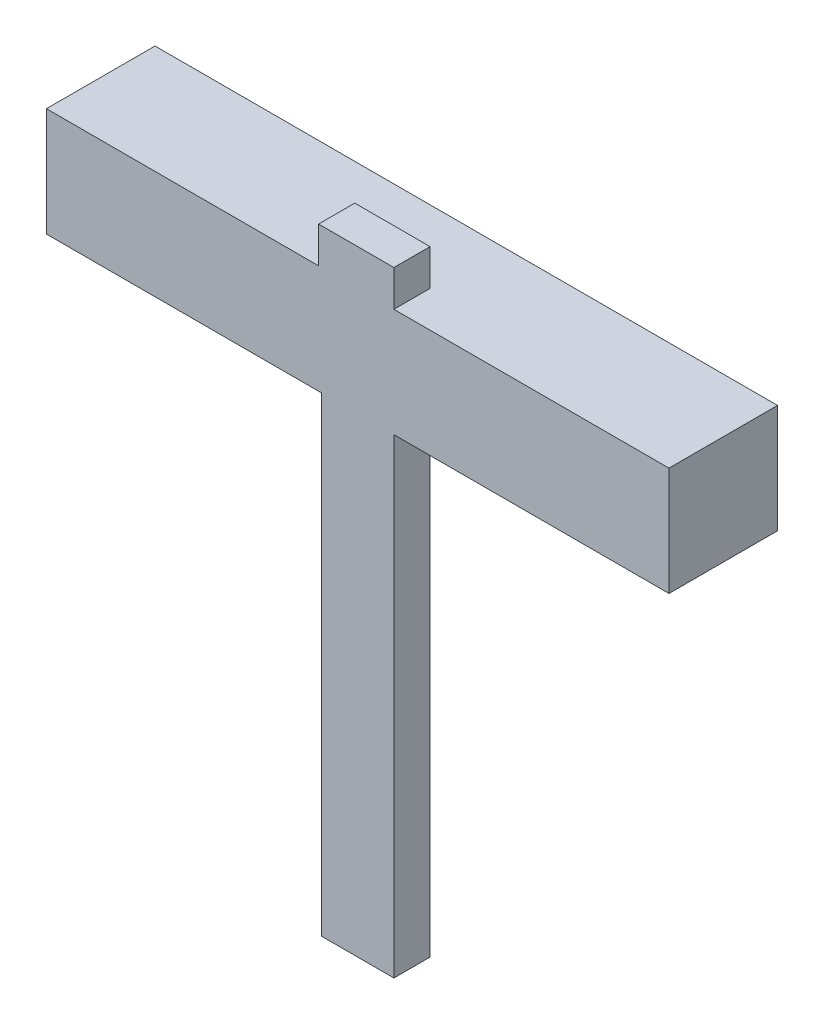
ISO-10303-21;
HEADER;
FILE_DESCRIPTION(('STEP AP214'),'2;1');
FILE_NAME('part.step','',(''),(''),'','','');
FILE_SCHEMA(('AUTOMOTIVE_DESIGN { 1 0 10303 214 1 1 1 1 }'));
ENDSEC;
DATA;
#1=APPLICATION_CONTEXT('core data for automotive mechanical design processes');
#2=APPLICATION_PROTOCOL_DEFINITION('international standard','automotive_design',2000,#1);
#3=PRODUCT_CONTEXT('',#1,'mechanical');
#4=PRODUCT('Part','Part','',(#3));
#5=PRODUCT_RELATED_PRODUCT_CATEGORY('part','',(#4));
#6=PRODUCT_DEFINITION_FORMATION('','',#4);
#7=PRODUCT_DEFINITION_CONTEXT('part definition',#1,'design');
#8=PRODUCT_DEFINITION('design','',#6,#7);
#9=PRODUCT_DEFINITION_SHAPE('','',#8);
#10=(LENGTH_UNIT() NAMED_UNIT(*) SI_UNIT(.MILLI.,.METRE.));
#11=(NAMED_UNIT(*) PLANE_ANGLE_UNIT() SI_UNIT($,.RADIAN.));
#12=(NAMED_UNIT(*) SI_UNIT($,.STERADIAN.) SOLID_ANGLE_UNIT());
#13=UNCERTAINTY_MEASURE_WITH_UNIT(LENGTH_MEASURE(1.E-05),#10,'distance_accuracy_value','');
#14=(GEOMETRIC_REPRESENTATION_CONTEXT(3) GLOBAL_UNCERTAINTY_ASSIGNED_CONTEXT((#13)) GLOBAL_UNIT_ASSIGNED_CONTEXT((#10,
#11,#12)) REPRESENTATION_CONTEXT('',''));
#15=CARTESIAN_POINT('',(0.,0.,0.));
#16=DIRECTION('',(0.,0.,1.));
#17=DIRECTION('',(1.,0.,0.));
#18=AXIS2_PLACEMENT_3D('',#15,#16,#17);
#19=CARTESIAN_POINT('',(0.,15.,0.));
#20=DIRECTION('',(0.,-1.,0.));
#21=DIRECTION('',(0.,0.,-1.));
#22=AXIS2_PLACEMENT_3D('',#19,#20,#21);
#23=PLANE('',#22);
#24=DIRECTION('',(0.,0.,-1.));
#25=VECTOR('',#24,1.);
#26=CARTESIAN_POINT('',(5.,15.,0.));
#27=LINE('',#26,#25);
#28=CARTESIAN_POINT('',(5.,15.,5.));
#29=VERTEX_POINT('',#28);
#30=CARTESIAN_POINT('',(5.,15.,0.));
#31=VERTEX_POINT('',#30);
#32=EDGE_CURVE('E59',#29,#31,#27,.T.);
#33=ORIENTED_EDGE('',*,*,#32,.F.);
#34=DIRECTION('',(1.,0.,0.));
#35=VECTOR('',#34,1.);
#36=CARTESIAN_POINT('',(-40.,15.,5.));
#37=LINE('',#36,#35);
#38=CARTESIAN_POINT('',(43.,15.,5.));
#39=VERTEX_POINT('',#38);
#40=EDGE_CURVE('E232',#29,#39,#37,.T.);
#41=ORIENTED_EDGE('',*,*,#40,.T.);
#42=DIRECTION('',(0.,0.,1.));
#43=VECTOR('',#42,1.);
#44=CARTESIAN_POINT('',(43.,15.,5.));
#45=LINE('',#44,#43);
#46=CARTESIAN_POINT('',(43.,15.,-10.));
#47=VERTEX_POINT('',#46);
#48=EDGE_CURVE('E222',#47,#39,#45,.T.);
#49=ORIENTED_EDGE('',*,*,#48,.F.);
#50=DIRECTION('',(-1.,0.,0.));
#51=VECTOR('',#50,1.);
#52=CARTESIAN_POINT('',(-40.,15.,-10.));
#53=LINE('',#52,#51);
#54=CARTESIAN_POINT('',(-43.,15.,-10.));
#55=VERTEX_POINT('',#54);
#56=EDGE_CURVE('E231',#47,#55,#53,.T.);
#57=ORIENTED_EDGE('',*,*,#56,.T.);
#58=DIRECTION('',(0.,0.,-1.));
#59=VECTOR('',#58,1.);
#60=CARTESIAN_POINT('',(-43.,15.,-10.));
#61=LINE('',#60,#59);
#62=CARTESIAN_POINT('',(-43.,15.,5.));
#63=VERTEX_POINT('',#62);
#64=EDGE_CURVE('E208',#63,#55,#61,.T.);
#65=ORIENTED_EDGE('',*,*,#64,.F.);
#66=CARTESIAN_POINT('',(-5.40455395030204,15.,5.));
#67=VERTEX_POINT('',#66);
#68=EDGE_CURVE('E229',#63,#67,#37,.T.);
#69=ORIENTED_EDGE('',*,*,#68,.T.);
#70=DIRECTION('',(0.,0.,1.));
#71=VECTOR('',#70,1.);
#72=CARTESIAN_POINT('',(-5.40455395030204,15.,0.));
#73=LINE('',#72,#71);
#74=CARTESIAN_POINT('',(-5.40455395030204,15.,0.));
#75=VERTEX_POINT('',#74);
#76=EDGE_CURVE('E169',#75,#67,#73,.T.);
#77=ORIENTED_EDGE('',*,*,#76,.F.);
#78=DIRECTION('',(-1.,0.,0.));
#79=VECTOR('',#78,1.);
#80=CARTESIAN_POINT('',(-5.40455395030204,15.,0.));
#81=LINE('',#80,#79);
#82=EDGE_CURVE('E54',#31,#75,#81,.T.);
#83=ORIENTED_EDGE('',*,*,#82,.F.);
#84=EDGE_LOOP('',(#33,#41,#49,#57,#65,#69,#77,#83));
#85=FACE_BOUND('',#84,.T.);
#86=ADVANCED_FACE('F39',(#85),#23,.F.);
#87=CARTESIAN_POINT('',(5.,0.,5.));
#88=DIRECTION('',(0.,1.,0.));
#89=DIRECTION('',(0.,0.,1.));
#90=AXIS2_PLACEMENT_3D('',#87,#88,#89);
#91=PLANE('',#90);
#92=DIRECTION('',(0.,0.,-1.));
#93=VECTOR('',#92,1.);
#94=CARTESIAN_POINT('',(40.08,0.,0.));
#95=LINE('',#94,#93);
#96=CARTESIAN_POINT('',(40.08,0.,0.));
#97=VERTEX_POINT('',#96);
#98=CARTESIAN_POINT('',(40.08,0.,-10.));
#99=VERTEX_POINT('',#98);
#100=EDGE_CURVE('E172',#97,#99,#95,.T.);
#101=ORIENTED_EDGE('',*,*,#100,.T.);
#102=DIRECTION('',(-1.,0.,0.));
#103=VECTOR('',#102,1.);
#104=CARTESIAN_POINT('',(43.,0.,-10.));
#105=LINE('',#104,#103);
#106=CARTESIAN_POINT('',(43.,0.,-10.));
#107=VERTEX_POINT('',#106);
#108=EDGE_CURVE('E225',#107,#99,#105,.T.);
#109=ORIENTED_EDGE('',*,*,#108,.F.);
#110=DIRECTION('',(0.,0.,-1.));
#111=VECTOR('',#110,1.);
#112=CARTESIAN_POINT('',(43.,0.,5.));
#113=LINE('',#112,#111);
#114=CARTESIAN_POINT('',(43.,0.,5.));
#115=VERTEX_POINT('',#114);
#116=EDGE_CURVE('E217',#115,#107,#113,.T.);
#117=ORIENTED_EDGE('',*,*,#116,.F.);
#118=DIRECTION('',(1.,0.,0.));
#119=VECTOR('',#118,1.);
#120=CARTESIAN_POINT('',(5.,0.,5.));
#121=LINE('',#120,#119);
#122=CARTESIAN_POINT('',(5.,0.,5.));
#123=VERTEX_POINT('',#122);
#124=EDGE_CURVE('E236',#123,#115,#121,.T.);
#125=ORIENTED_EDGE('',*,*,#124,.F.);
#126=DIRECTION('',(0.,0.,-1.));
#127=VECTOR('',#126,1.);
#128=CARTESIAN_POINT('',(5.,0.,5.));
#129=LINE('',#128,#127);
#130=CARTESIAN_POINT('',(5.,0.,0.));
#131=VERTEX_POINT('',#130);
#132=EDGE_CURVE('E247',#123,#131,#129,.T.);
#133=ORIENTED_EDGE('',*,*,#132,.T.);
#134=DIRECTION('',(1.,0.,0.));
#135=VECTOR('',#134,1.);
#136=CARTESIAN_POINT('',(5.,0.,0.));
#137=LINE('',#136,#135);
#138=EDGE_CURVE('E234',#131,#97,#137,.T.);
#139=ORIENTED_EDGE('',*,*,#138,.T.);
#140=EDGE_LOOP('',(#101,#109,#117,#125,#133,#139));
#141=FACE_BOUND('',#140,.T.);
#142=ADVANCED_FACE('F41',(#141),#91,.F.);
#143=CARTESIAN_POINT('',(-40.,15.,-10.));
#144=DIRECTION('',(0.,0.,1.));
#145=DIRECTION('',(1.,0.,0.));
#146=AXIS2_PLACEMENT_3D('',#143,#144,#145);
#147=PLANE('',#146);
#148=DIRECTION('',(-1.,0.,0.));
#149=VECTOR('',#148,1.);
#150=CARTESIAN_POINT('',(-40.,10.,-10.));
#151=LINE('',#150,#149);
#152=CARTESIAN_POINT('',(40.08,10.,-10.));
#153=VERTEX_POINT('',#152);
#154=CARTESIAN_POINT('',(-40.08,10.,-10.));
#155=VERTEX_POINT('',#154);
#156=EDGE_CURVE('E228',#153,#155,#151,.T.);
#157=ORIENTED_EDGE('',*,*,#156,.T.);
#158=DIRECTION('',(0.,-1.,0.));
#159=VECTOR('',#158,1.);
#160=CARTESIAN_POINT('',(-40.08,10.,-10.));
#161=LINE('',#160,#159);
#162=CARTESIAN_POINT('',(-40.08,0.,-10.));
#163=VERTEX_POINT('',#162);
#164=EDGE_CURVE('E188',#155,#163,#161,.T.);
#165=ORIENTED_EDGE('',*,*,#164,.T.);
#166=DIRECTION('',(1.,0.,0.));
#167=VECTOR('',#166,1.);
#168=CARTESIAN_POINT('',(-43.,0.,-10.));
#169=LINE('',#168,#167);
#170=CARTESIAN_POINT('',(-43.,0.,-10.));
#171=VERTEX_POINT('',#170);
#172=EDGE_CURVE('E211',#171,#163,#169,.T.);
#173=ORIENTED_EDGE('',*,*,#172,.F.);
#174=DIRECTION('',(0.,-1.,0.));
#175=VECTOR('',#174,1.);
#176=CARTESIAN_POINT('',(-43.,15.,-10.));
#177=LINE('',#176,#175);
#178=EDGE_CURVE('E191',#55,#171,#177,.T.);
#179=ORIENTED_EDGE('',*,*,#178,.F.);
#180=ORIENTED_EDGE('',*,*,#56,.F.);
#181=DIRECTION('',(0.,1.,0.));
#182=VECTOR('',#181,1.);
#183=CARTESIAN_POINT('',(43.,15.,-10.));
#184=LINE('',#183,#182);
#185=EDGE_CURVE('E219',#107,#47,#184,.T.);
#186=ORIENTED_EDGE('',*,*,#185,.F.);
#187=ORIENTED_EDGE('',*,*,#108,.T.);
#188=DIRECTION('',(0.,-1.,0.));
#189=VECTOR('',#188,1.);
#190=CARTESIAN_POINT('',(40.08,10.,-10.));
#191=LINE('',#190,#189);
#192=EDGE_CURVE('E187',#153,#99,#191,.T.);
#193=ORIENTED_EDGE('',*,*,#192,.F.);
#194=EDGE_LOOP('',(#157,#165,#173,#179,#180,#186,#187,#193));
#195=FACE_BOUND('',#194,.T.);
#196=ADVANCED_FACE('F308',(#195),#147,.F.);
#197=CARTESIAN_POINT('',(-40.,0.,5.));
#198=DIRECTION('',(0.,1.,0.));
#199=DIRECTION('',(0.,0.,1.));
#200=AXIS2_PLACEMENT_3D('',#197,#198,#199);
#201=PLANE('',#200);
#202=DIRECTION('',(0.,0.,-1.));
#203=VECTOR('',#202,1.);
#204=CARTESIAN_POINT('',(-40.08,0.,0.));
#205=LINE('',#204,#203);
#206=CARTESIAN_POINT('',(-40.08,0.,0.));
#207=VERTEX_POINT('',#206);
#208=EDGE_CURVE('E185',#207,#163,#205,.T.);
#209=ORIENTED_EDGE('',*,*,#208,.F.);
#210=DIRECTION('',(1.,0.,0.));
#211=VECTOR('',#210,1.);
#212=CARTESIAN_POINT('',(-40.,0.,0.));
#213=LINE('',#212,#211);
#214=CARTESIAN_POINT('',(-5.,0.,0.));
#215=VERTEX_POINT('',#214);
#216=EDGE_CURVE('E251',#207,#215,#213,.T.);
#217=ORIENTED_EDGE('',*,*,#216,.T.);
#218=DIRECTION('',(0.,0.,-1.));
#219=VECTOR('',#218,1.);
#220=CARTESIAN_POINT('',(-5.,0.,5.));
#221=LINE('',#220,#219);
#222=CARTESIAN_POINT('',(-5.,0.,5.));
#223=VERTEX_POINT('',#222);
#224=EDGE_CURVE('E11',#223,#215,#221,.T.);
#225=ORIENTED_EDGE('',*,*,#224,.F.);
#226=DIRECTION('',(1.,0.,0.));
#227=VECTOR('',#226,1.);
#228=CARTESIAN_POINT('',(-40.,0.,5.));
#229=LINE('',#228,#227);
#230=CARTESIAN_POINT('',(-43.,0.,5.));
#231=VERTEX_POINT('',#230);
#232=EDGE_CURVE('E238',#231,#223,#229,.T.);
#233=ORIENTED_EDGE('',*,*,#232,.F.);
#234=DIRECTION('',(0.,0.,1.));
#235=VECTOR('',#234,1.);
#236=CARTESIAN_POINT('',(-43.,0.,-10.));
#237=LINE('',#236,#235);
#238=EDGE_CURVE('E202',#171,#231,#237,.T.);
#239=ORIENTED_EDGE('',*,*,#238,.F.);
#240=ORIENTED_EDGE('',*,*,#172,.T.);
#241=EDGE_LOOP('',(#209,#217,#225,#233,#239,#240));
#242=FACE_BOUND('',#241,.T.);
#243=ADVANCED_FACE('F292',(#242),#201,.F.);
#244=CARTESIAN_POINT('',(-5.,0.,5.));
#245=DIRECTION('',(1.,0.,0.));
#246=DIRECTION('',(0.,0.,-1.));
#247=AXIS2_PLACEMENT_3D('',#244,#245,#246);
#248=PLANE('',#247);
#249=DIRECTION('',(0.,-1.,0.));
#250=VECTOR('',#249,1.);
#251=CARTESIAN_POINT('',(-5.,0.,0.));
#252=LINE('',#251,#250);
#253=CARTESIAN_POINT('',(-5.,-65.,0.));
#254=VERTEX_POINT('',#253);
#255=EDGE_CURVE('E253',#215,#254,#252,.T.);
#256=ORIENTED_EDGE('',*,*,#255,.T.);
#257=DIRECTION('',(0.,0.,-1.));
#258=VECTOR('',#257,1.);
#259=CARTESIAN_POINT('',(-5.,-65.,5.));
#260=LINE('',#259,#258);
#261=CARTESIAN_POINT('',(-5.,-65.,5.));
#262=VERTEX_POINT('',#261);
#263=EDGE_CURVE('E47',#262,#254,#260,.T.);
#264=ORIENTED_EDGE('',*,*,#263,.F.);
#265=DIRECTION('',(0.,-1.,0.));
#266=VECTOR('',#265,1.);
#267=CARTESIAN_POINT('',(-5.,0.,5.));
#268=LINE('',#267,#266);
#269=EDGE_CURVE('E241',#223,#262,#268,.T.);
#270=ORIENTED_EDGE('',*,*,#269,.F.);
#271=ORIENTED_EDGE('',*,*,#224,.T.);
#272=EDGE_LOOP('',(#256,#264,#270,#271));
#273=FACE_BOUND('',#272,.T.);
#274=ADVANCED_FACE('F289',(#273),#248,.F.);
#275=CARTESIAN_POINT('',(-5.,-65.,5.));
#276=DIRECTION('',(0.,1.,0.));
#277=DIRECTION('',(-1.,0.,0.));
#278=AXIS2_PLACEMENT_3D('',#275,#276,#277);
#279=PLANE('',#278);
#280=DIRECTION('',(1.,0.,0.));
#281=VECTOR('',#280,1.);
#282=CARTESIAN_POINT('',(-5.,-65.,0.));
#283=LINE('',#282,#281);
#284=CARTESIAN_POINT('',(5.,-65.,0.));
#285=VERTEX_POINT('',#284);
#286=EDGE_CURVE('E255',#254,#285,#283,.T.);
#287=ORIENTED_EDGE('',*,*,#286,.T.);
#288=DIRECTION('',(0.,0.,-1.));
#289=VECTOR('',#288,1.);
#290=CARTESIAN_POINT('',(5.,-65.,5.));
#291=LINE('',#290,#289);
#292=CARTESIAN_POINT('',(5.,-65.,5.));
#293=VERTEX_POINT('',#292);
#294=EDGE_CURVE('E260',#293,#285,#291,.T.);
#295=ORIENTED_EDGE('',*,*,#294,.F.);
#296=DIRECTION('',(1.,0.,0.));
#297=VECTOR('',#296,1.);
#298=CARTESIAN_POINT('',(-5.,-65.,5.));
#299=LINE('',#298,#297);
#300=EDGE_CURVE('E243',#262,#293,#299,.T.);
#301=ORIENTED_EDGE('',*,*,#300,.F.);
#302=ORIENTED_EDGE('',*,*,#263,.T.);
#303=EDGE_LOOP('',(#287,#295,#301,#302));
#304=FACE_BOUND('',#303,.T.);
#305=ADVANCED_FACE('F267',(#304),#279,.F.);
#306=CARTESIAN_POINT('',(5.,0.,5.));
#307=DIRECTION('',(-1.,0.,0.));
#308=DIRECTION('',(0.,-1.,0.));
#309=AXIS2_PLACEMENT_3D('',#306,#307,#308);
#310=PLANE('',#309);
#311=DIRECTION('',(0.,1.,0.));
#312=VECTOR('',#311,1.);
#313=CARTESIAN_POINT('',(5.,0.,0.));
#314=LINE('',#313,#312);
#315=EDGE_CURVE('E239',#285,#131,#314,.T.);
#316=ORIENTED_EDGE('',*,*,#315,.T.);
#317=ORIENTED_EDGE('',*,*,#132,.F.);
#318=DIRECTION('',(0.,1.,0.));
#319=VECTOR('',#318,1.);
#320=CARTESIAN_POINT('',(5.,0.,5.));
#321=LINE('',#320,#319);
#322=EDGE_CURVE('E245',#293,#123,#321,.T.);
#323=ORIENTED_EDGE('',*,*,#322,.F.);
#324=ORIENTED_EDGE('',*,*,#294,.T.);
#325=EDGE_LOOP('',(#316,#317,#323,#324));
#326=FACE_BOUND('',#325,.T.);
#327=ADVANCED_FACE('F278',(#326),#310,.F.);
#328=CARTESIAN_POINT('',(0.,0.,5.));
#329=DIRECTION('',(0.,0.,-1.));
#330=DIRECTION('',(-1.,0.,0.));
#331=AXIS2_PLACEMENT_3D('',#328,#329,#330);
#332=PLANE('',#331);
#333=ORIENTED_EDGE('',*,*,#124,.T.);
#334=DIRECTION('',(0.,-1.,0.));
#335=VECTOR('',#334,1.);
#336=CARTESIAN_POINT('',(43.,15.,5.));
#337=LINE('',#336,#335);
#338=EDGE_CURVE('E214',#39,#115,#337,.T.);
#339=ORIENTED_EDGE('',*,*,#338,.F.);
#340=ORIENTED_EDGE('',*,*,#40,.F.);
#341=DIRECTION('',(0.,-1.,0.));
#342=VECTOR('',#341,1.);
#343=CARTESIAN_POINT('',(5.,20.,5.));
#344=LINE('',#343,#342);
#345=CARTESIAN_POINT('',(5.,20.,5.));
#346=VERTEX_POINT('',#345);
#347=EDGE_CURVE('E314',#346,#29,#344,.T.);
#348=ORIENTED_EDGE('',*,*,#347,.F.);
#349=DIRECTION('',(1.,0.,0.));
#350=VECTOR('',#349,1.);
#351=CARTESIAN_POINT('',(-5.40455395030204,20.,5.));
#352=LINE('',#351,#350);
#353=CARTESIAN_POINT('',(-5.40455395030204,20.,5.));
#354=VERTEX_POINT('',#353);
#355=EDGE_CURVE('E165',#354,#346,#352,.T.);
#356=ORIENTED_EDGE('',*,*,#355,.F.);
#357=DIRECTION('',(0.,-1.,0.));
#358=VECTOR('',#357,1.);
#359=CARTESIAN_POINT('',(-5.40455395030204,20.,5.));
#360=LINE('',#359,#358);
#361=EDGE_CURVE('E177',#354,#67,#360,.T.);
#362=ORIENTED_EDGE('',*,*,#361,.T.);
#363=ORIENTED_EDGE('',*,*,#68,.F.);
#364=DIRECTION('',(0.,1.,0.));
#365=VECTOR('',#364,1.);
#366=CARTESIAN_POINT('',(-43.,15.,5.));
#367=LINE('',#366,#365);
#368=EDGE_CURVE('E205',#231,#63,#367,.T.);
#369=ORIENTED_EDGE('',*,*,#368,.F.);
#370=ORIENTED_EDGE('',*,*,#232,.T.);
#371=ORIENTED_EDGE('',*,*,#269,.T.);
#372=ORIENTED_EDGE('',*,*,#300,.T.);
#373=ORIENTED_EDGE('',*,*,#322,.T.);
#374=EDGE_LOOP('',(#333,#339,#340,#348,#356,#362,#363,#369,#370,#371,#372,#373));
#375=FACE_BOUND('',#374,.T.);
#376=ADVANCED_FACE('F286',(#375),#332,.F.);
#377=CARTESIAN_POINT('',(0.,0.,0.));
#378=DIRECTION('',(0.,0.,-1.));
#379=DIRECTION('',(-1.,0.,0.));
#380=AXIS2_PLACEMENT_3D('',#377,#378,#379);
#381=PLANE('',#380);
#382=ORIENTED_EDGE('',*,*,#138,.F.);
#383=ORIENTED_EDGE('',*,*,#315,.F.);
#384=ORIENTED_EDGE('',*,*,#286,.F.);
#385=ORIENTED_EDGE('',*,*,#255,.F.);
#386=ORIENTED_EDGE('',*,*,#216,.F.);
#387=DIRECTION('',(0.,-1.,0.));
#388=VECTOR('',#387,1.);
#389=CARTESIAN_POINT('',(-40.08,10.,0.));
#390=LINE('',#389,#388);
#391=CARTESIAN_POINT('',(-40.08,10.,0.));
#392=VERTEX_POINT('',#391);
#393=EDGE_CURVE('E184',#392,#207,#390,.T.);
#394=ORIENTED_EDGE('',*,*,#393,.F.);
#395=DIRECTION('',(-1.,0.,0.));
#396=VECTOR('',#395,1.);
#397=CARTESIAN_POINT('',(-40.,10.,0.));
#398=LINE('',#397,#396);
#399=CARTESIAN_POINT('',(40.08,10.,0.));
#400=VERTEX_POINT('',#399);
#401=EDGE_CURVE('E249',#400,#392,#398,.T.);
#402=ORIENTED_EDGE('',*,*,#401,.F.);
#403=DIRECTION('',(0.,-1.,0.));
#404=VECTOR('',#403,1.);
#405=CARTESIAN_POINT('',(40.08,10.,0.));
#406=LINE('',#405,#404);
#407=EDGE_CURVE('E195',#400,#97,#406,.T.);
#408=ORIENTED_EDGE('',*,*,#407,.T.);
#409=EDGE_LOOP('',(#382,#383,#384,#385,#386,#394,#402,#408));
#410=FACE_BOUND('',#409,.T.);
#411=ADVANCED_FACE('F275',(#410),#381,.T.);
#412=CARTESIAN_POINT('',(0.,10.,0.));
#413=DIRECTION('',(0.,-1.,0.));
#414=DIRECTION('',(0.,0.,-1.));
#415=AXIS2_PLACEMENT_3D('',#412,#413,#414);
#416=PLANE('',#415);
#417=ORIENTED_EDGE('',*,*,#156,.F.);
#418=DIRECTION('',(0.,0.,-1.));
#419=VECTOR('',#418,1.);
#420=CARTESIAN_POINT('',(40.08,10.,0.));
#421=LINE('',#420,#419);
#422=EDGE_CURVE('E175',#400,#153,#421,.T.);
#423=ORIENTED_EDGE('',*,*,#422,.F.);
#424=ORIENTED_EDGE('',*,*,#401,.T.);
#425=DIRECTION('',(0.,0.,-1.));
#426=VECTOR('',#425,1.);
#427=CARTESIAN_POINT('',(-40.08,10.,0.));
#428=LINE('',#427,#426);
#429=EDGE_CURVE('E181',#392,#155,#428,.T.);
#430=ORIENTED_EDGE('',*,*,#429,.T.);
#431=EDGE_LOOP('',(#417,#423,#424,#430));
#432=FACE_BOUND('',#431,.T.);
#433=ADVANCED_FACE('F299',(#432),#416,.T.);
#434=CARTESIAN_POINT('',(43.,0.,0.));
#435=DIRECTION('',(1.,0.,0.));
#436=DIRECTION('',(0.,0.,-1.));
#437=AXIS2_PLACEMENT_3D('',#434,#435,#436);
#438=PLANE('',#437);
#439=ORIENTED_EDGE('',*,*,#338,.T.);
#440=ORIENTED_EDGE('',*,*,#116,.T.);
#441=ORIENTED_EDGE('',*,*,#185,.T.);
#442=ORIENTED_EDGE('',*,*,#48,.T.);
#443=EDGE_LOOP('',(#439,#440,#441,#442));
#444=FACE_BOUND('',#443,.T.);
#445=ADVANCED_FACE('F312',(#444),#438,.T.);
#446=CARTESIAN_POINT('',(-43.,0.,0.));
#447=DIRECTION('',(-1.,0.,0.));
#448=DIRECTION('',(0.,0.,1.));
#449=AXIS2_PLACEMENT_3D('',#446,#447,#448);
#450=PLANE('',#449);
#451=ORIENTED_EDGE('',*,*,#178,.T.);
#452=ORIENTED_EDGE('',*,*,#238,.T.);
#453=ORIENTED_EDGE('',*,*,#368,.T.);
#454=ORIENTED_EDGE('',*,*,#64,.T.);
#455=EDGE_LOOP('',(#451,#452,#453,#454));
#456=FACE_BOUND('',#455,.T.);
#457=ADVANCED_FACE('F327',(#456),#450,.T.);
#458=CARTESIAN_POINT('',(-40.08,10.,0.));
#459=DIRECTION('',(-1.,0.,0.));
#460=DIRECTION('',(0.,0.,1.));
#461=AXIS2_PLACEMENT_3D('',#458,#459,#460);
#462=PLANE('',#461);
#463=ORIENTED_EDGE('',*,*,#208,.T.);
#464=ORIENTED_EDGE('',*,*,#164,.F.);
#465=ORIENTED_EDGE('',*,*,#429,.F.);
#466=ORIENTED_EDGE('',*,*,#393,.T.);
#467=EDGE_LOOP('',(#463,#464,#465,#466));
#468=FACE_BOUND('',#467,.T.);
#469=ADVANCED_FACE('F296',(#468),#462,.F.);
#470=CARTESIAN_POINT('',(40.08,10.,0.));
#471=DIRECTION('',(-1.,0.,0.));
#472=DIRECTION('',(0.,0.,1.));
#473=AXIS2_PLACEMENT_3D('',#470,#471,#472);
#474=PLANE('',#473);
#475=ORIENTED_EDGE('',*,*,#100,.F.);
#476=ORIENTED_EDGE('',*,*,#407,.F.);
#477=ORIENTED_EDGE('',*,*,#422,.T.);
#478=ORIENTED_EDGE('',*,*,#192,.T.);
#479=EDGE_LOOP('',(#475,#476,#477,#478));
#480=FACE_BOUND('',#479,.T.);
#481=ADVANCED_FACE('F304',(#480),#474,.T.);
#482=CARTESIAN_POINT('',(5.,20.,0.));
#483=DIRECTION('',(-1.,0.,0.));
#484=DIRECTION('',(0.,0.,1.));
#485=AXIS2_PLACEMENT_3D('',#482,#483,#484);
#486=PLANE('',#485);
#487=ORIENTED_EDGE('',*,*,#32,.T.);
#488=DIRECTION('',(0.,-1.,0.));
#489=VECTOR('',#488,1.);
#490=CARTESIAN_POINT('',(5.,20.,0.));
#491=LINE('',#490,#489);
#492=CARTESIAN_POINT('',(5.,20.,0.));
#493=VERTEX_POINT('',#492);
#494=EDGE_CURVE('E154',#493,#31,#491,.T.);
#495=ORIENTED_EDGE('',*,*,#494,.F.);
#496=DIRECTION('',(0.,0.,-1.));
#497=VECTOR('',#496,1.);
#498=CARTESIAN_POINT('',(5.,20.,0.));
#499=LINE('',#498,#497);
#500=EDGE_CURVE('E160',#346,#493,#499,.T.);
#501=ORIENTED_EDGE('',*,*,#500,.F.);
#502=ORIENTED_EDGE('',*,*,#347,.T.);
#503=EDGE_LOOP('',(#487,#495,#501,#502));
#504=FACE_BOUND('',#503,.T.);
#505=ADVANCED_FACE('F171',(#504),#486,.F.);
#506=CARTESIAN_POINT('',(-5.40455395030204,20.,0.));
#507=DIRECTION('',(0.,0.,1.));
#508=DIRECTION('',(1.,0.,0.));
#509=AXIS2_PLACEMENT_3D('',#506,#507,#508);
#510=PLANE('',#509);
#511=ORIENTED_EDGE('',*,*,#82,.T.);
#512=DIRECTION('',(0.,-1.,0.));
#513=VECTOR('',#512,1.);
#514=CARTESIAN_POINT('',(-5.40455395030204,20.,0.));
#515=LINE('',#514,#513);
#516=CARTESIAN_POINT('',(-5.40455395030204,20.,0.));
#517=VERTEX_POINT('',#516);
#518=EDGE_CURVE('E156',#517,#75,#515,.T.);
#519=ORIENTED_EDGE('',*,*,#518,.F.);
#520=DIRECTION('',(-1.,0.,0.));
#521=VECTOR('',#520,1.);
#522=CARTESIAN_POINT('',(-5.40455395030204,20.,0.));
#523=LINE('',#522,#521);
#524=EDGE_CURVE('E150',#493,#517,#523,.T.);
#525=ORIENTED_EDGE('',*,*,#524,.F.);
#526=ORIENTED_EDGE('',*,*,#494,.T.);
#527=EDGE_LOOP('',(#511,#519,#525,#526));
#528=FACE_BOUND('',#527,.T.);
#529=ADVANCED_FACE('F152',(#528),#510,.F.);
#530=CARTESIAN_POINT('',(-5.40455395030204,20.,0.));
#531=DIRECTION('',(1.,0.,0.));
#532=DIRECTION('',(0.,0.,-1.));
#533=AXIS2_PLACEMENT_3D('',#530,#531,#532);
#534=PLANE('',#533);
#535=ORIENTED_EDGE('',*,*,#76,.T.);
#536=ORIENTED_EDGE('',*,*,#361,.F.);
#537=DIRECTION('',(0.,0.,1.));
#538=VECTOR('',#537,1.);
#539=CARTESIAN_POINT('',(-5.40455395030204,20.,0.));
#540=LINE('',#539,#538);
#541=EDGE_CURVE('E159',#517,#354,#540,.T.);
#542=ORIENTED_EDGE('',*,*,#541,.F.);
#543=ORIENTED_EDGE('',*,*,#518,.T.);
#544=EDGE_LOOP('',(#535,#536,#542,#543));
#545=FACE_BOUND('',#544,.T.);
#546=ADVANCED_FACE('F325',(#545),#534,.F.);
#547=CARTESIAN_POINT('',(0.,20.,0.));
#548=DIRECTION('',(0.,1.,0.));
#549=DIRECTION('',(0.,0.,1.));
#550=AXIS2_PLACEMENT_3D('',#547,#548,#549);
#551=PLANE('',#550);
#552=ORIENTED_EDGE('',*,*,#500,.T.);
#553=ORIENTED_EDGE('',*,*,#524,.T.);
#554=ORIENTED_EDGE('',*,*,#541,.T.);
#555=ORIENTED_EDGE('',*,*,#355,.T.);
#556=EDGE_LOOP('',(#552,#553,#554,#555));
#557=FACE_BOUND('',#556,.T.);
#558=ADVANCED_FACE('F163',(#557),#551,.T.);
#559=CLOSED_SHELL('',(#86,#142,#196,#243,#274,#305,#327,#376,#411,#433,#445,#457,#469,#481,#505,
#529,#546,#558));
#560=MANIFOLD_SOLID_BREP('B2',#559);
#561=ADVANCED_BREP_SHAPE_REPRESENTATION('',(#18,#560),#14);
#562=SHAPE_DEFINITION_REPRESENTATION(#9,#561);
ENDSEC;
END-ISO-10303-21;
